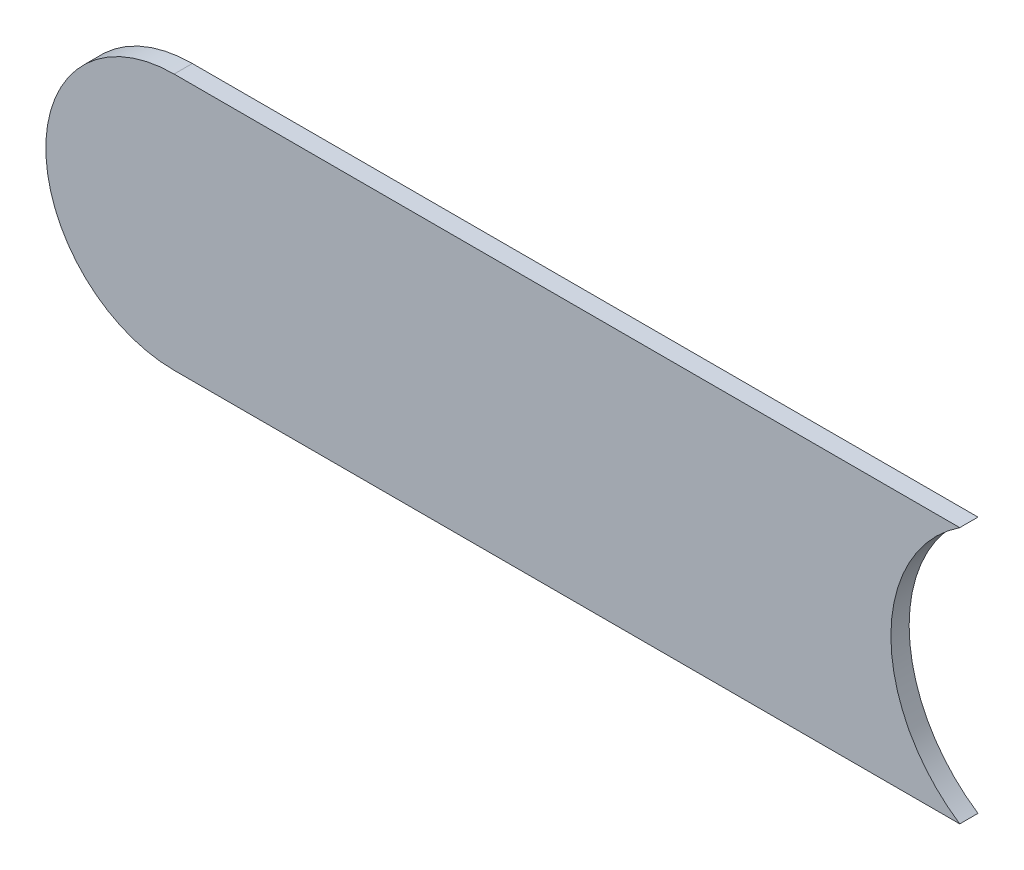
ISO-10303-21;
HEADER;
FILE_DESCRIPTION(('STEP AP214'),'2;1');
FILE_NAME('part.step','',(''),(''),'','','');
FILE_SCHEMA(('AUTOMOTIVE_DESIGN { 1 0 10303 214 1 1 1 1 }'));
ENDSEC;
DATA;
#1=APPLICATION_CONTEXT('core data for automotive mechanical design processes');
#2=APPLICATION_PROTOCOL_DEFINITION('international standard','automotive_design',2000,#1);
#3=PRODUCT_CONTEXT('',#1,'mechanical');
#4=PRODUCT('Part','Part','',(#3));
#5=PRODUCT_RELATED_PRODUCT_CATEGORY('part','',(#4));
#6=PRODUCT_DEFINITION_FORMATION('','',#4);
#7=PRODUCT_DEFINITION_CONTEXT('part definition',#1,'design');
#8=PRODUCT_DEFINITION('design','',#6,#7);
#9=PRODUCT_DEFINITION_SHAPE('','',#8);
#10=(LENGTH_UNIT() NAMED_UNIT(*) SI_UNIT(.MILLI.,.METRE.));
#11=(NAMED_UNIT(*) PLANE_ANGLE_UNIT() SI_UNIT($,.RADIAN.));
#12=(NAMED_UNIT(*) SI_UNIT($,.STERADIAN.) SOLID_ANGLE_UNIT());
#13=UNCERTAINTY_MEASURE_WITH_UNIT(LENGTH_MEASURE(1.E-05),#10,'distance_accuracy_value','');
#14=(GEOMETRIC_REPRESENTATION_CONTEXT(3) GLOBAL_UNCERTAINTY_ASSIGNED_CONTEXT((#13)) GLOBAL_UNIT_ASSIGNED_CONTEXT((#10,
#11,#12)) REPRESENTATION_CONTEXT('',''));
#15=CARTESIAN_POINT('',(0.,0.,0.));
#16=DIRECTION('',(0.,0.,1.));
#17=DIRECTION('',(1.,0.,0.));
#18=AXIS2_PLACEMENT_3D('',#15,#16,#17);
#19=CARTESIAN_POINT('',(83.70316,82.7499869,0.));
#20=DIRECTION('',(0.,1.,0.));
#21=DIRECTION('',(1.,0.,0.));
#22=AXIS2_PLACEMENT_3D('',#19,#20,#21);
#23=PLANE('',#22);
#24=DIRECTION('',(1.,0.,0.));
#25=VECTOR('',#24,1.);
#26=CARTESIAN_POINT('',(83.70316,82.7499869,0.03556));
#27=LINE('',#26,#25);
#28=CARTESIAN_POINT('',(83.70316,82.7499869,0.03556));
#29=VERTEX_POINT('',#28);
#30=CARTESIAN_POINT('',(85.2341506921447,82.7499869,0.03556));
#31=VERTEX_POINT('',#30);
#32=EDGE_CURVE('E11',#29,#31,#27,.T.);
#33=ORIENTED_EDGE('',*,*,#32,.F.);
#34=DIRECTION('',(0.,0.,1.));
#35=VECTOR('',#34,1.);
#36=CARTESIAN_POINT('',(83.70316,82.7499869,0.));
#37=LINE('',#36,#35);
#38=CARTESIAN_POINT('',(83.70316,82.7499869,0.));
#39=VERTEX_POINT('',#38);
#40=EDGE_CURVE('E24',#39,#29,#37,.T.);
#41=ORIENTED_EDGE('',*,*,#40,.F.);
#42=DIRECTION('',(1.,0.,0.));
#43=VECTOR('',#42,1.);
#44=CARTESIAN_POINT('',(83.70316,82.7499869,0.));
#45=LINE('',#44,#43);
#46=CARTESIAN_POINT('',(85.2341506921447,82.7499869,0.));
#47=VERTEX_POINT('',#46);
#48=EDGE_CURVE('E75',#39,#47,#45,.T.);
#49=ORIENTED_EDGE('',*,*,#48,.T.);
#50=DIRECTION('',(0.,0.,1.));
#51=VECTOR('',#50,1.);
#52=CARTESIAN_POINT('',(85.2341506921447,82.7499869,0.));
#53=LINE('',#52,#51);
#54=EDGE_CURVE('E37',#47,#31,#53,.T.);
#55=ORIENTED_EDGE('',*,*,#54,.T.);
#56=EDGE_LOOP('',(#33,#41,#49,#55));
#57=FACE_BOUND('',#56,.T.);
#58=ADVANCED_FACE('F17',(#57),#23,.F.);
#59=CARTESIAN_POINT('',(85.3999816,82.9999864,0.));
#60=DIRECTION('',(0.,0.,-1.));
#61=DIRECTION('',(1.,0.,0.));
#62=AXIS2_PLACEMENT_3D('',#59,#60,#61);
#63=CYLINDRICAL_SURFACE('',#62,0.2999994);
#64=DIRECTION('',(0.,0.,1.));
#65=VECTOR('',#64,1.);
#66=CARTESIAN_POINT('',(85.2341506921447,83.2499859,0.));
#67=LINE('',#66,#65);
#68=CARTESIAN_POINT('',(85.2341506921447,83.2499859,0.));
#69=VERTEX_POINT('',#68);
#70=CARTESIAN_POINT('',(85.2341506921447,83.2499859,0.03556));
#71=VERTEX_POINT('',#70);
#72=EDGE_CURVE('E67',#69,#71,#67,.T.);
#73=ORIENTED_EDGE('',*,*,#72,.T.);
#74=CARTESIAN_POINT('',(85.3999816,82.9999864,0.03556));
#75=DIRECTION('',(0.,0.,1.));
#76=DIRECTION('',(1.,0.,0.));
#77=AXIS2_PLACEMENT_3D('',#74,#75,#76);
#78=CIRCLE('',#77,0.2999994);
#79=EDGE_CURVE('E82',#71,#31,#78,.T.);
#80=ORIENTED_EDGE('',*,*,#79,.T.);
#81=ORIENTED_EDGE('',*,*,#54,.F.);
#82=CARTESIAN_POINT('',(85.3999816,82.9999864,0.));
#83=DIRECTION('',(0.,0.,1.));
#84=DIRECTION('',(1.,0.,0.));
#85=AXIS2_PLACEMENT_3D('',#82,#83,#84);
#86=CIRCLE('',#85,0.2999994);
#87=EDGE_CURVE('E80',#69,#47,#86,.T.);
#88=ORIENTED_EDGE('',*,*,#87,.F.);
#89=EDGE_LOOP('',(#73,#80,#81,#88));
#90=FACE_BOUND('',#89,.T.);
#91=ADVANCED_FACE('F88',(#90),#63,.F.);
#92=CARTESIAN_POINT('',(85.2341506921447,83.2499859,0.));
#93=DIRECTION('',(0.,-1.,0.));
#94=DIRECTION('',(-1.,0.,0.));
#95=AXIS2_PLACEMENT_3D('',#92,#93,#94);
#96=PLANE('',#95);
#97=DIRECTION('',(-1.,0.,0.));
#98=VECTOR('',#97,1.);
#99=CARTESIAN_POINT('',(85.3999816,83.2499859,0.03556));
#100=LINE('',#99,#98);
#101=CARTESIAN_POINT('',(83.70316,83.2499859,0.03556));
#102=VERTEX_POINT('',#101);
#103=EDGE_CURVE('E71',#71,#102,#100,.T.);
#104=ORIENTED_EDGE('',*,*,#103,.F.);
#105=ORIENTED_EDGE('',*,*,#72,.F.);
#106=DIRECTION('',(-1.,0.,0.));
#107=VECTOR('',#106,1.);
#108=CARTESIAN_POINT('',(85.3999816,83.2499859,0.));
#109=LINE('',#108,#107);
#110=CARTESIAN_POINT('',(83.70316,83.2499859,0.));
#111=VERTEX_POINT('',#110);
#112=EDGE_CURVE('E63',#69,#111,#109,.T.);
#113=ORIENTED_EDGE('',*,*,#112,.T.);
#114=DIRECTION('',(0.,0.,1.));
#115=VECTOR('',#114,1.);
#116=CARTESIAN_POINT('',(83.70316,83.2499859,0.));
#117=LINE('',#116,#115);
#118=EDGE_CURVE('E53',#111,#102,#117,.T.);
#119=ORIENTED_EDGE('',*,*,#118,.T.);
#120=EDGE_LOOP('',(#104,#105,#113,#119));
#121=FACE_BOUND('',#120,.T.);
#122=ADVANCED_FACE('F66',(#121),#96,.F.);
#123=CARTESIAN_POINT('',(83.70316,82.9999864,0.));
#124=DIRECTION('',(0.,0.,-1.));
#125=DIRECTION('',(0.,1.,0.));
#126=AXIS2_PLACEMENT_3D('',#123,#124,#125);
#127=CYLINDRICAL_SURFACE('',#126,0.249999500000001);
#128=CARTESIAN_POINT('',(83.70316,82.9999864,0.03556));
#129=DIRECTION('',(0.,0.,1.));
#130=DIRECTION('',(0.,1.,0.));
#131=AXIS2_PLACEMENT_3D('',#128,#129,#130);
#132=CIRCLE('',#131,0.249999500000001);
#133=EDGE_CURVE('E59',#102,#29,#132,.T.);
#134=ORIENTED_EDGE('',*,*,#133,.F.);
#135=ORIENTED_EDGE('',*,*,#118,.F.);
#136=CARTESIAN_POINT('',(83.70316,82.9999864,0.));
#137=DIRECTION('',(0.,0.,1.));
#138=DIRECTION('',(0.,1.,0.));
#139=AXIS2_PLACEMENT_3D('',#136,#137,#138);
#140=CIRCLE('',#139,0.249999500000001);
#141=EDGE_CURVE('E57',#111,#39,#140,.T.);
#142=ORIENTED_EDGE('',*,*,#141,.T.);
#143=ORIENTED_EDGE('',*,*,#40,.T.);
#144=EDGE_LOOP('',(#134,#135,#142,#143));
#145=FACE_BOUND('',#144,.T.);
#146=ADVANCED_FACE('F55',(#145),#127,.T.);
#147=CARTESIAN_POINT('',(83.70316,82.7499869,0.));
#148=DIRECTION('',(0.,0.,-1.));
#149=DIRECTION('',(-1.,0.,0.));
#150=AXIS2_PLACEMENT_3D('',#147,#148,#149);
#151=PLANE('',#150);
#152=ORIENTED_EDGE('',*,*,#48,.F.);
#153=ORIENTED_EDGE('',*,*,#141,.F.);
#154=ORIENTED_EDGE('',*,*,#112,.F.);
#155=ORIENTED_EDGE('',*,*,#87,.T.);
#156=EDGE_LOOP('',(#152,#153,#154,#155));
#157=FACE_BOUND('',#156,.T.);
#158=ADVANCED_FACE('F74',(#157),#151,.T.);
#159=CARTESIAN_POINT('',(83.70316,82.7499869,0.03556));
#160=DIRECTION('',(0.,0.,-1.));
#161=DIRECTION('',(-1.,0.,0.));
#162=AXIS2_PLACEMENT_3D('',#159,#160,#161);
#163=PLANE('',#162);
#164=ORIENTED_EDGE('',*,*,#133,.T.);
#165=ORIENTED_EDGE('',*,*,#32,.T.);
#166=ORIENTED_EDGE('',*,*,#79,.F.);
#167=ORIENTED_EDGE('',*,*,#103,.T.);
#168=EDGE_LOOP('',(#164,#165,#166,#167));
#169=FACE_BOUND('',#168,.T.);
#170=ADVANCED_FACE('F91',(#169),#163,.F.);
#171=CLOSED_SHELL('',(#58,#91,#122,#146,#158,#170));
#172=MANIFOLD_SOLID_BREP('B1',#171);
#173=ADVANCED_BREP_SHAPE_REPRESENTATION('',(#18,#172),#14);
#174=SHAPE_DEFINITION_REPRESENTATION(#9,#173);
ENDSEC;
END-ISO-10303-21;
